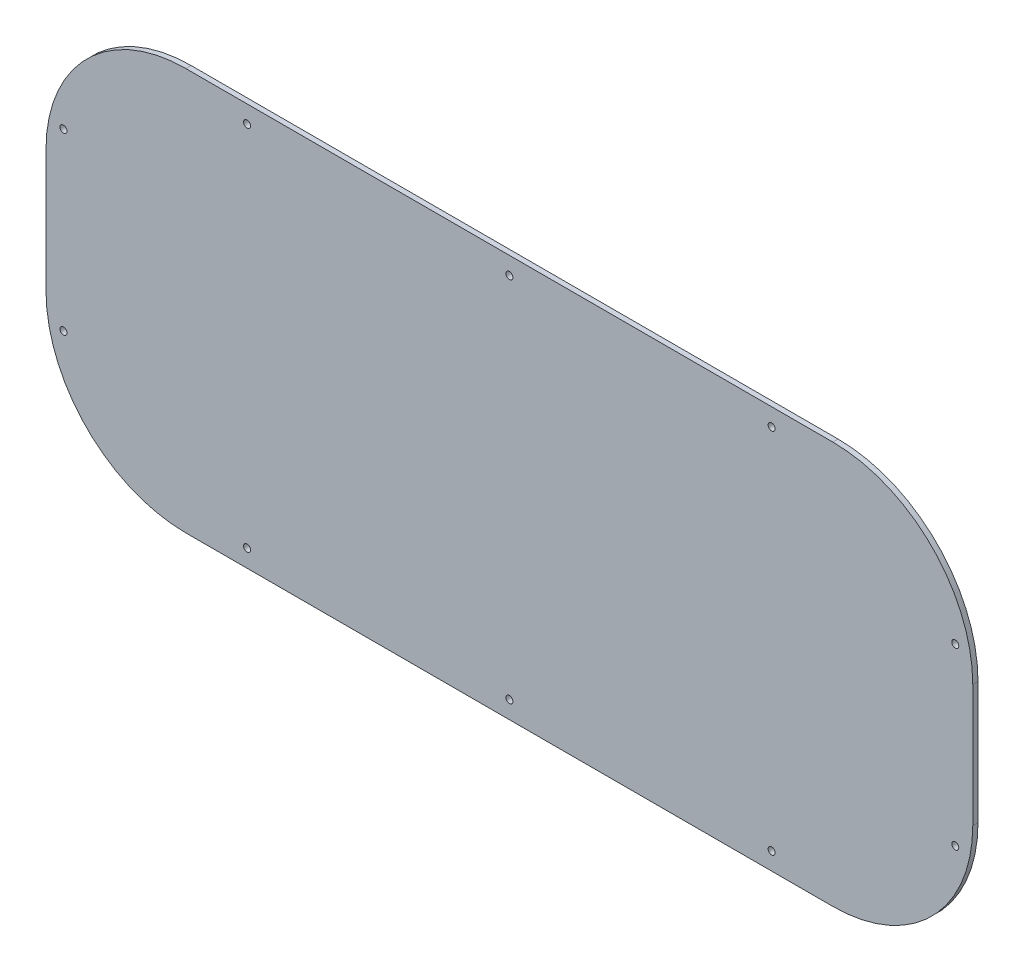
ISO-10303-21;
HEADER;
FILE_DESCRIPTION(('STEP AP214'),'2;1');
FILE_NAME('part.step','',(''),(''),'','','');
FILE_SCHEMA(('AUTOMOTIVE_DESIGN { 1 0 10303 214 1 1 1 1 }'));
ENDSEC;
DATA;
#1=APPLICATION_CONTEXT('core data for automotive mechanical design processes');
#2=APPLICATION_PROTOCOL_DEFINITION('international standard','automotive_design',2000,#1);
#3=PRODUCT_CONTEXT('',#1,'mechanical');
#4=PRODUCT('Part','Part','',(#3));
#5=PRODUCT_RELATED_PRODUCT_CATEGORY('part','',(#4));
#6=PRODUCT_DEFINITION_FORMATION('','',#4);
#7=PRODUCT_DEFINITION_CONTEXT('part definition',#1,'design');
#8=PRODUCT_DEFINITION('design','',#6,#7);
#9=PRODUCT_DEFINITION_SHAPE('','',#8);
#10=(LENGTH_UNIT() NAMED_UNIT(*) SI_UNIT(.MILLI.,.METRE.));
#11=(NAMED_UNIT(*) PLANE_ANGLE_UNIT() SI_UNIT($,.RADIAN.));
#12=(NAMED_UNIT(*) SI_UNIT($,.STERADIAN.) SOLID_ANGLE_UNIT());
#13=UNCERTAINTY_MEASURE_WITH_UNIT(LENGTH_MEASURE(1.E-05),#10,'distance_accuracy_value','');
#14=(GEOMETRIC_REPRESENTATION_CONTEXT(3) GLOBAL_UNCERTAINTY_ASSIGNED_CONTEXT((#13)) GLOBAL_UNIT_ASSIGNED_CONTEXT((#10,
#11,#12)) REPRESENTATION_CONTEXT('',''));
#15=CARTESIAN_POINT('',(0.,0.,0.));
#16=DIRECTION('',(0.,0.,1.));
#17=DIRECTION('',(1.,0.,0.));
#18=AXIS2_PLACEMENT_3D('',#15,#16,#17);
#19=CARTESIAN_POINT('',(265.,115.,3.));
#20=DIRECTION('',(-1.,0.,0.));
#21=DIRECTION('',(0.,0.,1.));
#22=AXIS2_PLACEMENT_3D('',#19,#20,#21);
#23=PLANE('',#22);
#24=DIRECTION('',(0.,1.,0.));
#25=VECTOR('',#24,1.);
#26=CARTESIAN_POINT('',(265.,115.,0.));
#27=LINE('',#26,#25);
#28=CARTESIAN_POINT('',(265.,-35.,0.));
#29=VERTEX_POINT('',#28);
#30=CARTESIAN_POINT('',(265.,35.,0.));
#31=VERTEX_POINT('',#30);
#32=EDGE_CURVE('E129',#29,#31,#27,.T.);
#33=ORIENTED_EDGE('',*,*,#32,.T.);
#34=DIRECTION('',(0.,0.,-1.));
#35=VECTOR('',#34,1.);
#36=CARTESIAN_POINT('',(265.,35.,3.));
#37=LINE('',#36,#35);
#38=CARTESIAN_POINT('',(265.,35.,3.));
#39=VERTEX_POINT('',#38);
#40=EDGE_CURVE('E107',#31,#39,#37,.F.);
#41=ORIENTED_EDGE('',*,*,#40,.T.);
#42=DIRECTION('',(0.,1.,0.));
#43=VECTOR('',#42,1.);
#44=CARTESIAN_POINT('',(265.,115.,3.));
#45=LINE('',#44,#43);
#46=CARTESIAN_POINT('',(265.,-35.,3.));
#47=VERTEX_POINT('',#46);
#48=EDGE_CURVE('E139',#47,#39,#45,.T.);
#49=ORIENTED_EDGE('',*,*,#48,.F.);
#50=DIRECTION('',(0.,0.,-1.));
#51=VECTOR('',#50,1.);
#52=CARTESIAN_POINT('',(265.,-35.,3.));
#53=LINE('',#52,#51);
#54=EDGE_CURVE('E112',#47,#29,#53,.T.);
#55=ORIENTED_EDGE('',*,*,#54,.T.);
#56=EDGE_LOOP('',(#33,#41,#49,#55));
#57=FACE_BOUND('',#56,.T.);
#58=ADVANCED_FACE('F34',(#57),#23,.F.);
#59=CARTESIAN_POINT('',(-265.,115.,3.));
#60=DIRECTION('',(0.,-1.,0.));
#61=DIRECTION('',(0.,0.,-1.));
#62=AXIS2_PLACEMENT_3D('',#59,#60,#61);
#63=PLANE('',#62);
#64=DIRECTION('',(-1.,0.,0.));
#65=VECTOR('',#64,1.);
#66=CARTESIAN_POINT('',(-265.,115.,3.));
#67=LINE('',#66,#65);
#68=CARTESIAN_POINT('',(185.,115.,3.));
#69=VERTEX_POINT('',#68);
#70=CARTESIAN_POINT('',(-185.,115.,3.));
#71=VERTEX_POINT('',#70);
#72=EDGE_CURVE('E122',#69,#71,#67,.T.);
#73=ORIENTED_EDGE('',*,*,#72,.F.);
#74=DIRECTION('',(0.,0.,-1.));
#75=VECTOR('',#74,1.);
#76=CARTESIAN_POINT('',(185.,115.,3.));
#77=LINE('',#76,#75);
#78=CARTESIAN_POINT('',(185.,115.,0.));
#79=VERTEX_POINT('',#78);
#80=EDGE_CURVE('E106',#69,#79,#77,.T.);
#81=ORIENTED_EDGE('',*,*,#80,.T.);
#82=DIRECTION('',(-1.,0.,0.));
#83=VECTOR('',#82,1.);
#84=CARTESIAN_POINT('',(-265.,115.,0.));
#85=LINE('',#84,#83);
#86=CARTESIAN_POINT('',(-185.,115.,0.));
#87=VERTEX_POINT('',#86);
#88=EDGE_CURVE('E119',#79,#87,#85,.T.);
#89=ORIENTED_EDGE('',*,*,#88,.T.);
#90=DIRECTION('',(0.,0.,-1.));
#91=VECTOR('',#90,1.);
#92=CARTESIAN_POINT('',(-185.,115.,3.));
#93=LINE('',#92,#91);
#94=EDGE_CURVE('E124',#87,#71,#93,.F.);
#95=ORIENTED_EDGE('',*,*,#94,.T.);
#96=EDGE_LOOP('',(#73,#81,#89,#95));
#97=FACE_BOUND('',#96,.T.);
#98=ADVANCED_FACE('F118',(#97),#63,.F.);
#99=CARTESIAN_POINT('',(-265.,115.,3.));
#100=DIRECTION('',(1.,0.,0.));
#101=DIRECTION('',(0.,0.,-1.));
#102=AXIS2_PLACEMENT_3D('',#99,#100,#101);
#103=PLANE('',#102);
#104=DIRECTION('',(0.,-1.,0.));
#105=VECTOR('',#104,1.);
#106=CARTESIAN_POINT('',(-265.,115.,3.));
#107=LINE('',#106,#105);
#108=CARTESIAN_POINT('',(-265.,35.,3.));
#109=VERTEX_POINT('',#108);
#110=CARTESIAN_POINT('',(-265.,-35.,3.));
#111=VERTEX_POINT('',#110);
#112=EDGE_CURVE('E204',#109,#111,#107,.T.);
#113=ORIENTED_EDGE('',*,*,#112,.F.);
#114=DIRECTION('',(0.,0.,-1.));
#115=VECTOR('',#114,1.);
#116=CARTESIAN_POINT('',(-265.,35.,3.));
#117=LINE('',#116,#115);
#118=CARTESIAN_POINT('',(-265.,35.,0.));
#119=VERTEX_POINT('',#118);
#120=EDGE_CURVE('E158',#109,#119,#117,.T.);
#121=ORIENTED_EDGE('',*,*,#120,.T.);
#122=DIRECTION('',(0.,-1.,0.));
#123=VECTOR('',#122,1.);
#124=CARTESIAN_POINT('',(-265.,115.,0.));
#125=LINE('',#124,#123);
#126=CARTESIAN_POINT('',(-265.,-35.,0.));
#127=VERTEX_POINT('',#126);
#128=EDGE_CURVE('E128',#119,#127,#125,.T.);
#129=ORIENTED_EDGE('',*,*,#128,.T.);
#130=DIRECTION('',(0.,0.,-1.));
#131=VECTOR('',#130,1.);
#132=CARTESIAN_POINT('',(-265.,-35.,3.));
#133=LINE('',#132,#131);
#134=EDGE_CURVE('E156',#127,#111,#133,.F.);
#135=ORIENTED_EDGE('',*,*,#134,.T.);
#136=EDGE_LOOP('',(#113,#121,#129,#135));
#137=FACE_BOUND('',#136,.T.);
#138=ADVANCED_FACE('F219',(#137),#103,.F.);
#139=CARTESIAN_POINT('',(-265.,-115.,3.));
#140=DIRECTION('',(0.,1.,0.));
#141=DIRECTION('',(0.,0.,1.));
#142=AXIS2_PLACEMENT_3D('',#139,#140,#141);
#143=PLANE('',#142);
#144=DIRECTION('',(1.,0.,0.));
#145=VECTOR('',#144,1.);
#146=CARTESIAN_POINT('',(-265.,-115.,3.));
#147=LINE('',#146,#145);
#148=CARTESIAN_POINT('',(-185.,-115.,3.));
#149=VERTEX_POINT('',#148);
#150=CARTESIAN_POINT('',(185.,-115.,3.));
#151=VERTEX_POINT('',#150);
#152=EDGE_CURVE('E140',#149,#151,#147,.T.);
#153=ORIENTED_EDGE('',*,*,#152,.F.);
#154=DIRECTION('',(0.,0.,-1.));
#155=VECTOR('',#154,1.);
#156=CARTESIAN_POINT('',(-185.,-115.,3.));
#157=LINE('',#156,#155);
#158=CARTESIAN_POINT('',(-185.,-115.,0.));
#159=VERTEX_POINT('',#158);
#160=EDGE_CURVE('E11',#149,#159,#157,.T.);
#161=ORIENTED_EDGE('',*,*,#160,.T.);
#162=DIRECTION('',(1.,0.,0.));
#163=VECTOR('',#162,1.);
#164=CARTESIAN_POINT('',(-265.,-115.,0.));
#165=LINE('',#164,#163);
#166=CARTESIAN_POINT('',(185.,-115.,0.));
#167=VERTEX_POINT('',#166);
#168=EDGE_CURVE('E132',#159,#167,#165,.T.);
#169=ORIENTED_EDGE('',*,*,#168,.T.);
#170=DIRECTION('',(0.,0.,-1.));
#171=VECTOR('',#170,1.);
#172=CARTESIAN_POINT('',(185.,-115.,3.));
#173=LINE('',#172,#171);
#174=EDGE_CURVE('E43',#167,#151,#173,.F.);
#175=ORIENTED_EDGE('',*,*,#174,.T.);
#176=EDGE_LOOP('',(#153,#161,#169,#175));
#177=FACE_BOUND('',#176,.T.);
#178=ADVANCED_FACE('F213',(#177),#143,.F.);
#179=CARTESIAN_POINT('',(0.,0.,3.));
#180=DIRECTION('',(0.,0.,1.));
#181=DIRECTION('',(1.,0.,0.));
#182=AXIS2_PLACEMENT_3D('',#179,#180,#181);
#183=PLANE('',#182);
#184=CARTESIAN_POINT('',(-150.,105.,3.));
#185=DIRECTION('',(0.,0.,1.));
#186=DIRECTION('',(1.,0.,0.));
#187=AXIS2_PLACEMENT_3D('',#184,#185,#186);
#188=CIRCLE('',#187,2.);
#189=CARTESIAN_POINT('',(-148.,105.,3.));
#190=VERTEX_POINT('',#189);
#191=EDGE_CURVE('E322',#190,#190,#188,.T.);
#192=ORIENTED_EDGE('',*,*,#191,.F.);
#193=EDGE_LOOP('',(#192));
#194=FACE_BOUND('',#193,.T.);
#195=CARTESIAN_POINT('',(-2.03851808720352E-13,105.,3.));
#196=DIRECTION('',(0.,0.,1.));
#197=DIRECTION('',(1.,0.,0.));
#198=AXIS2_PLACEMENT_3D('',#195,#196,#197);
#199=CIRCLE('',#198,2.);
#200=CARTESIAN_POINT('',(1.9999999999998,105.,3.));
#201=VERTEX_POINT('',#200);
#202=EDGE_CURVE('E319',#201,#201,#199,.T.);
#203=ORIENTED_EDGE('',*,*,#202,.F.);
#204=EDGE_LOOP('',(#203));
#205=FACE_BOUND('',#204,.T.);
#206=CARTESIAN_POINT('',(150.,105.,3.));
#207=DIRECTION('',(0.,0.,1.));
#208=DIRECTION('',(1.,0.,0.));
#209=AXIS2_PLACEMENT_3D('',#206,#207,#208);
#210=CIRCLE('',#209,2.);
#211=CARTESIAN_POINT('',(152.,105.,3.));
#212=VERTEX_POINT('',#211);
#213=EDGE_CURVE('E314',#212,#212,#210,.T.);
#214=ORIENTED_EDGE('',*,*,#213,.F.);
#215=EDGE_LOOP('',(#214));
#216=FACE_BOUND('',#215,.T.);
#217=CARTESIAN_POINT('',(255.,50.0000000000001,3.));
#218=DIRECTION('',(0.,0.,1.));
#219=DIRECTION('',(1.,0.,0.));
#220=AXIS2_PLACEMENT_3D('',#217,#218,#219);
#221=CIRCLE('',#220,2.);
#222=CARTESIAN_POINT('',(257.,50.0000000000001,3.));
#223=VERTEX_POINT('',#222);
#224=EDGE_CURVE('E309',#223,#223,#221,.T.);
#225=ORIENTED_EDGE('',*,*,#224,.F.);
#226=EDGE_LOOP('',(#225));
#227=FACE_BOUND('',#226,.T.);
#228=CARTESIAN_POINT('',(255.,-49.9999999999999,3.));
#229=DIRECTION('',(0.,0.,1.));
#230=DIRECTION('',(1.,0.,0.));
#231=AXIS2_PLACEMENT_3D('',#228,#229,#230);
#232=CIRCLE('',#231,2.);
#233=CARTESIAN_POINT('',(257.,-49.9999999999999,3.));
#234=VERTEX_POINT('',#233);
#235=EDGE_CURVE('E290',#234,#234,#232,.T.);
#236=ORIENTED_EDGE('',*,*,#235,.F.);
#237=EDGE_LOOP('',(#236));
#238=FACE_BOUND('',#237,.T.);
#239=CARTESIAN_POINT('',(150.,-105.,3.));
#240=DIRECTION('',(0.,0.,1.));
#241=DIRECTION('',(1.,0.,0.));
#242=AXIS2_PLACEMENT_3D('',#239,#240,#241);
#243=CIRCLE('',#242,2.);
#244=CARTESIAN_POINT('',(152.,-105.,3.));
#245=VERTEX_POINT('',#244);
#246=EDGE_CURVE('E199',#245,#245,#243,.T.);
#247=ORIENTED_EDGE('',*,*,#246,.F.);
#248=EDGE_LOOP('',(#247));
#249=FACE_BOUND('',#248,.T.);
#250=CARTESIAN_POINT('',(-3.20425226306045E-13,-105.,3.));
#251=DIRECTION('',(0.,0.,1.));
#252=DIRECTION('',(1.,0.,0.));
#253=AXIS2_PLACEMENT_3D('',#250,#251,#252);
#254=CIRCLE('',#253,2.);
#255=CARTESIAN_POINT('',(1.99999999999968,-105.,3.));
#256=VERTEX_POINT('',#255);
#257=EDGE_CURVE('E312',#256,#256,#254,.T.);
#258=ORIENTED_EDGE('',*,*,#257,.F.);
#259=EDGE_LOOP('',(#258));
#260=FACE_BOUND('',#259,.T.);
#261=CARTESIAN_POINT('',(-150.,-105.,3.));
#262=DIRECTION('',(0.,0.,1.));
#263=DIRECTION('',(1.,0.,0.));
#264=AXIS2_PLACEMENT_3D('',#261,#262,#263);
#265=CIRCLE('',#264,2.);
#266=CARTESIAN_POINT('',(-148.,-105.,3.));
#267=VERTEX_POINT('',#266);
#268=EDGE_CURVE('E327',#267,#267,#265,.T.);
#269=ORIENTED_EDGE('',*,*,#268,.F.);
#270=EDGE_LOOP('',(#269));
#271=FACE_BOUND('',#270,.T.);
#272=CARTESIAN_POINT('',(-255.,50.0000000000003,3.));
#273=DIRECTION('',(0.,0.,1.));
#274=DIRECTION('',(1.,0.,0.));
#275=AXIS2_PLACEMENT_3D('',#272,#273,#274);
#276=CIRCLE('',#275,2.);
#277=CARTESIAN_POINT('',(-253.,50.0000000000003,3.));
#278=VERTEX_POINT('',#277);
#279=EDGE_CURVE('E169',#278,#278,#276,.T.);
#280=ORIENTED_EDGE('',*,*,#279,.F.);
#281=EDGE_LOOP('',(#280));
#282=FACE_BOUND('',#281,.T.);
#283=CARTESIAN_POINT('',(-255.,-49.9999999999997,3.));
#284=DIRECTION('',(0.,0.,1.));
#285=DIRECTION('',(1.,0.,0.));
#286=AXIS2_PLACEMENT_3D('',#283,#284,#285);
#287=CIRCLE('',#286,2.);
#288=CARTESIAN_POINT('',(-253.,-49.9999999999997,3.));
#289=VERTEX_POINT('',#288);
#290=EDGE_CURVE('E164',#289,#289,#287,.T.);
#291=ORIENTED_EDGE('',*,*,#290,.F.);
#292=EDGE_LOOP('',(#291));
#293=FACE_BOUND('',#292,.T.);
#294=ORIENTED_EDGE('',*,*,#48,.T.);
#295=CARTESIAN_POINT('',(185.,35.,3.));
#296=DIRECTION('',(0.,0.,1.));
#297=DIRECTION('',(1.,0.,0.));
#298=AXIS2_PLACEMENT_3D('',#295,#296,#297);
#299=CIRCLE('',#298,80.);
#300=EDGE_CURVE('E154',#39,#69,#299,.T.);
#301=ORIENTED_EDGE('',*,*,#300,.T.);
#302=ORIENTED_EDGE('',*,*,#72,.T.);
#303=CARTESIAN_POINT('',(-185.,35.,3.));
#304=DIRECTION('',(0.,0.,1.));
#305=DIRECTION('',(1.,0.,0.));
#306=AXIS2_PLACEMENT_3D('',#303,#304,#305);
#307=CIRCLE('',#306,80.);
#308=EDGE_CURVE('E152',#71,#109,#307,.T.);
#309=ORIENTED_EDGE('',*,*,#308,.T.);
#310=ORIENTED_EDGE('',*,*,#112,.T.);
#311=CARTESIAN_POINT('',(-185.,-35.,3.));
#312=DIRECTION('',(0.,0.,1.));
#313=DIRECTION('',(1.,0.,0.));
#314=AXIS2_PLACEMENT_3D('',#311,#312,#313);
#315=CIRCLE('',#314,80.);
#316=EDGE_CURVE('E57',#111,#149,#315,.T.);
#317=ORIENTED_EDGE('',*,*,#316,.T.);
#318=ORIENTED_EDGE('',*,*,#152,.T.);
#319=CARTESIAN_POINT('',(185.,-35.,3.));
#320=DIRECTION('',(0.,0.,1.));
#321=DIRECTION('',(1.,0.,0.));
#322=AXIS2_PLACEMENT_3D('',#319,#320,#321);
#323=CIRCLE('',#322,80.);
#324=EDGE_CURVE('E149',#151,#47,#323,.T.);
#325=ORIENTED_EDGE('',*,*,#324,.T.);
#326=EDGE_LOOP('',(#294,#301,#302,#309,#310,#317,#318,#325));
#327=FACE_BOUND('',#326,.T.);
#328=ADVANCED_FACE('F206',(#194,#205,#216,#227,#238,#249,#260,#271,#282,#293,#327),#183,.T.);
#329=CARTESIAN_POINT('',(0.,0.,0.));
#330=DIRECTION('',(0.,0.,1.));
#331=DIRECTION('',(1.,0.,0.));
#332=AXIS2_PLACEMENT_3D('',#329,#330,#331);
#333=PLANE('',#332);
#334=CARTESIAN_POINT('',(-150.,105.,0.));
#335=DIRECTION('',(0.,0.,1.));
#336=DIRECTION('',(1.,0.,0.));
#337=AXIS2_PLACEMENT_3D('',#334,#335,#336);
#338=CIRCLE('',#337,2.);
#339=CARTESIAN_POINT('',(-148.,105.,0.));
#340=VERTEX_POINT('',#339);
#341=EDGE_CURVE('E38',#340,#340,#338,.T.);
#342=ORIENTED_EDGE('',*,*,#341,.T.);
#343=EDGE_LOOP('',(#342));
#344=FACE_BOUND('',#343,.T.);
#345=CARTESIAN_POINT('',(-2.03851808720352E-13,105.,0.));
#346=DIRECTION('',(0.,0.,1.));
#347=DIRECTION('',(1.,0.,0.));
#348=AXIS2_PLACEMENT_3D('',#345,#346,#347);
#349=CIRCLE('',#348,2.);
#350=CARTESIAN_POINT('',(1.9999999999998,105.,0.));
#351=VERTEX_POINT('',#350);
#352=EDGE_CURVE('E186',#351,#351,#349,.T.);
#353=ORIENTED_EDGE('',*,*,#352,.T.);
#354=EDGE_LOOP('',(#353));
#355=FACE_BOUND('',#354,.T.);
#356=CARTESIAN_POINT('',(150.,105.,0.));
#357=DIRECTION('',(0.,0.,1.));
#358=DIRECTION('',(1.,0.,0.));
#359=AXIS2_PLACEMENT_3D('',#356,#357,#358);
#360=CIRCLE('',#359,2.);
#361=CARTESIAN_POINT('',(152.,105.,0.));
#362=VERTEX_POINT('',#361);
#363=EDGE_CURVE('E184',#362,#362,#360,.T.);
#364=ORIENTED_EDGE('',*,*,#363,.T.);
#365=EDGE_LOOP('',(#364));
#366=FACE_BOUND('',#365,.T.);
#367=CARTESIAN_POINT('',(255.,50.0000000000001,0.));
#368=DIRECTION('',(0.,0.,1.));
#369=DIRECTION('',(1.,0.,0.));
#370=AXIS2_PLACEMENT_3D('',#367,#368,#369);
#371=CIRCLE('',#370,2.);
#372=CARTESIAN_POINT('',(257.,50.0000000000001,0.));
#373=VERTEX_POINT('',#372);
#374=EDGE_CURVE('E181',#373,#373,#371,.T.);
#375=ORIENTED_EDGE('',*,*,#374,.T.);
#376=EDGE_LOOP('',(#375));
#377=FACE_BOUND('',#376,.T.);
#378=CARTESIAN_POINT('',(255.,-49.9999999999999,0.));
#379=DIRECTION('',(0.,0.,1.));
#380=DIRECTION('',(1.,0.,0.));
#381=AXIS2_PLACEMENT_3D('',#378,#379,#380);
#382=CIRCLE('',#381,2.);
#383=CARTESIAN_POINT('',(257.,-49.9999999999999,0.));
#384=VERTEX_POINT('',#383);
#385=EDGE_CURVE('E178',#384,#384,#382,.T.);
#386=ORIENTED_EDGE('',*,*,#385,.T.);
#387=EDGE_LOOP('',(#386));
#388=FACE_BOUND('',#387,.T.);
#389=CARTESIAN_POINT('',(150.,-105.,0.));
#390=DIRECTION('',(0.,0.,1.));
#391=DIRECTION('',(1.,0.,0.));
#392=AXIS2_PLACEMENT_3D('',#389,#390,#391);
#393=CIRCLE('',#392,2.);
#394=CARTESIAN_POINT('',(152.,-105.,0.));
#395=VERTEX_POINT('',#394);
#396=EDGE_CURVE('E175',#395,#395,#393,.T.);
#397=ORIENTED_EDGE('',*,*,#396,.T.);
#398=EDGE_LOOP('',(#397));
#399=FACE_BOUND('',#398,.T.);
#400=CARTESIAN_POINT('',(-3.20425226306045E-13,-105.,0.));
#401=DIRECTION('',(0.,0.,1.));
#402=DIRECTION('',(1.,0.,0.));
#403=AXIS2_PLACEMENT_3D('',#400,#401,#402);
#404=CIRCLE('',#403,2.);
#405=CARTESIAN_POINT('',(1.99999999999968,-105.,0.));
#406=VERTEX_POINT('',#405);
#407=EDGE_CURVE('E172',#406,#406,#404,.T.);
#408=ORIENTED_EDGE('',*,*,#407,.T.);
#409=EDGE_LOOP('',(#408));
#410=FACE_BOUND('',#409,.T.);
#411=CARTESIAN_POINT('',(-150.,-105.,0.));
#412=DIRECTION('',(0.,0.,1.));
#413=DIRECTION('',(1.,0.,0.));
#414=AXIS2_PLACEMENT_3D('',#411,#412,#413);
#415=CIRCLE('',#414,2.);
#416=CARTESIAN_POINT('',(-148.,-105.,0.));
#417=VERTEX_POINT('',#416);
#418=EDGE_CURVE('E168',#417,#417,#415,.T.);
#419=ORIENTED_EDGE('',*,*,#418,.T.);
#420=EDGE_LOOP('',(#419));
#421=FACE_BOUND('',#420,.T.);
#422=CARTESIAN_POINT('',(-255.,50.0000000000003,0.));
#423=DIRECTION('',(0.,0.,1.));
#424=DIRECTION('',(1.,0.,0.));
#425=AXIS2_PLACEMENT_3D('',#422,#423,#424);
#426=CIRCLE('',#425,2.);
#427=CARTESIAN_POINT('',(-253.,50.0000000000003,0.));
#428=VERTEX_POINT('',#427);
#429=EDGE_CURVE('E165',#428,#428,#426,.T.);
#430=ORIENTED_EDGE('',*,*,#429,.T.);
#431=EDGE_LOOP('',(#430));
#432=FACE_BOUND('',#431,.T.);
#433=CARTESIAN_POINT('',(-255.,-49.9999999999997,0.));
#434=DIRECTION('',(0.,0.,1.));
#435=DIRECTION('',(1.,0.,0.));
#436=AXIS2_PLACEMENT_3D('',#433,#434,#435);
#437=CIRCLE('',#436,2.);
#438=CARTESIAN_POINT('',(-253.,-49.9999999999997,0.));
#439=VERTEX_POINT('',#438);
#440=EDGE_CURVE('E134',#439,#439,#437,.T.);
#441=ORIENTED_EDGE('',*,*,#440,.T.);
#442=EDGE_LOOP('',(#441));
#443=FACE_BOUND('',#442,.T.);
#444=ORIENTED_EDGE('',*,*,#88,.F.);
#445=CARTESIAN_POINT('',(185.,35.,0.));
#446=DIRECTION('',(0.,0.,1.));
#447=DIRECTION('',(1.,0.,0.));
#448=AXIS2_PLACEMENT_3D('',#445,#446,#447);
#449=CIRCLE('',#448,80.);
#450=EDGE_CURVE('E102',#79,#31,#449,.F.);
#451=ORIENTED_EDGE('',*,*,#450,.T.);
#452=ORIENTED_EDGE('',*,*,#32,.F.);
#453=CARTESIAN_POINT('',(185.,-35.,0.));
#454=DIRECTION('',(0.,0.,1.));
#455=DIRECTION('',(1.,0.,0.));
#456=AXIS2_PLACEMENT_3D('',#453,#454,#455);
#457=CIRCLE('',#456,80.);
#458=EDGE_CURVE('E123',#29,#167,#457,.F.);
#459=ORIENTED_EDGE('',*,*,#458,.T.);
#460=ORIENTED_EDGE('',*,*,#168,.F.);
#461=CARTESIAN_POINT('',(-185.,-35.,0.));
#462=DIRECTION('',(0.,0.,1.));
#463=DIRECTION('',(1.,0.,0.));
#464=AXIS2_PLACEMENT_3D('',#461,#462,#463);
#465=CIRCLE('',#464,80.);
#466=EDGE_CURVE('E143',#159,#127,#465,.F.);
#467=ORIENTED_EDGE('',*,*,#466,.T.);
#468=ORIENTED_EDGE('',*,*,#128,.F.);
#469=CARTESIAN_POINT('',(-185.,35.,0.));
#470=DIRECTION('',(0.,0.,1.));
#471=DIRECTION('',(1.,0.,0.));
#472=AXIS2_PLACEMENT_3D('',#469,#470,#471);
#473=CIRCLE('',#472,80.);
#474=EDGE_CURVE('E113',#119,#87,#473,.F.);
#475=ORIENTED_EDGE('',*,*,#474,.T.);
#476=EDGE_LOOP('',(#444,#451,#452,#459,#460,#467,#468,#475));
#477=FACE_BOUND('',#476,.T.);
#478=ADVANCED_FACE('F126',(#344,#355,#366,#377,#388,#399,#410,#421,#432,#443,#477),#333,.F.);
#479=CARTESIAN_POINT('',(185.,35.,3.));
#480=DIRECTION('',(0.,0.,-1.));
#481=DIRECTION('',(-1.,0.,0.));
#482=AXIS2_PLACEMENT_3D('',#479,#480,#481);
#483=CYLINDRICAL_SURFACE('',#482,80.);
#484=ORIENTED_EDGE('',*,*,#300,.F.);
#485=ORIENTED_EDGE('',*,*,#40,.F.);
#486=ORIENTED_EDGE('',*,*,#450,.F.);
#487=ORIENTED_EDGE('',*,*,#80,.F.);
#488=EDGE_LOOP('',(#484,#485,#486,#487));
#489=FACE_BOUND('',#488,.T.);
#490=ADVANCED_FACE('F105',(#489),#483,.T.);
#491=CARTESIAN_POINT('',(-185.,35.,3.));
#492=DIRECTION('',(0.,0.,-1.));
#493=DIRECTION('',(-1.,0.,0.));
#494=AXIS2_PLACEMENT_3D('',#491,#492,#493);
#495=CYLINDRICAL_SURFACE('',#494,80.);
#496=ORIENTED_EDGE('',*,*,#308,.F.);
#497=ORIENTED_EDGE('',*,*,#94,.F.);
#498=ORIENTED_EDGE('',*,*,#474,.F.);
#499=ORIENTED_EDGE('',*,*,#120,.F.);
#500=EDGE_LOOP('',(#496,#497,#498,#499));
#501=FACE_BOUND('',#500,.T.);
#502=ADVANCED_FACE('F223',(#501),#495,.T.);
#503=CARTESIAN_POINT('',(-185.,-35.,3.));
#504=DIRECTION('',(0.,0.,-1.));
#505=DIRECTION('',(-1.,0.,0.));
#506=AXIS2_PLACEMENT_3D('',#503,#504,#505);
#507=CYLINDRICAL_SURFACE('',#506,80.);
#508=ORIENTED_EDGE('',*,*,#316,.F.);
#509=ORIENTED_EDGE('',*,*,#134,.F.);
#510=ORIENTED_EDGE('',*,*,#466,.F.);
#511=ORIENTED_EDGE('',*,*,#160,.F.);
#512=EDGE_LOOP('',(#508,#509,#510,#511));
#513=FACE_BOUND('',#512,.T.);
#514=ADVANCED_FACE('F215',(#513),#507,.T.);
#515=CARTESIAN_POINT('',(185.,-35.,3.));
#516=DIRECTION('',(0.,0.,-1.));
#517=DIRECTION('',(-1.,0.,0.));
#518=AXIS2_PLACEMENT_3D('',#515,#516,#517);
#519=CYLINDRICAL_SURFACE('',#518,80.);
#520=ORIENTED_EDGE('',*,*,#324,.F.);
#521=ORIENTED_EDGE('',*,*,#174,.F.);
#522=ORIENTED_EDGE('',*,*,#458,.F.);
#523=ORIENTED_EDGE('',*,*,#54,.F.);
#524=EDGE_LOOP('',(#520,#521,#522,#523));
#525=FACE_BOUND('',#524,.T.);
#526=ADVANCED_FACE('F36',(#525),#519,.T.);
#527=CARTESIAN_POINT('',(-255.,-49.9999999999997,-7.));
#528=DIRECTION('',(0.,0.,1.));
#529=DIRECTION('',(1.,0.,0.));
#530=AXIS2_PLACEMENT_3D('',#527,#528,#529);
#531=CYLINDRICAL_SURFACE('',#530,2.);
#532=ORIENTED_EDGE('',*,*,#290,.T.);
#533=EDGE_LOOP('',(#532));
#534=FACE_BOUND('',#533,.T.);
#535=ORIENTED_EDGE('',*,*,#440,.F.);
#536=EDGE_LOOP('',(#535));
#537=FACE_BOUND('',#536,.T.);
#538=ADVANCED_FACE('F247',(#534,#537),#531,.F.);
#539=CARTESIAN_POINT('',(-255.,50.0000000000003,-7.));
#540=DIRECTION('',(0.,0.,1.));
#541=DIRECTION('',(1.,0.,0.));
#542=AXIS2_PLACEMENT_3D('',#539,#540,#541);
#543=CYLINDRICAL_SURFACE('',#542,2.);
#544=ORIENTED_EDGE('',*,*,#279,.T.);
#545=EDGE_LOOP('',(#544));
#546=FACE_BOUND('',#545,.T.);
#547=ORIENTED_EDGE('',*,*,#429,.F.);
#548=EDGE_LOOP('',(#547));
#549=FACE_BOUND('',#548,.T.);
#550=ADVANCED_FACE('F250',(#546,#549),#543,.F.);
#551=CARTESIAN_POINT('',(-150.,-105.,-7.));
#552=DIRECTION('',(0.,0.,1.));
#553=DIRECTION('',(1.,0.,0.));
#554=AXIS2_PLACEMENT_3D('',#551,#552,#553);
#555=CYLINDRICAL_SURFACE('',#554,2.);
#556=ORIENTED_EDGE('',*,*,#268,.T.);
#557=EDGE_LOOP('',(#556));
#558=FACE_BOUND('',#557,.T.);
#559=ORIENTED_EDGE('',*,*,#418,.F.);
#560=EDGE_LOOP('',(#559));
#561=FACE_BOUND('',#560,.T.);
#562=ADVANCED_FACE('F259',(#558,#561),#555,.F.);
#563=CARTESIAN_POINT('',(-3.20425226306045E-13,-105.,-7.));
#564=DIRECTION('',(0.,0.,1.));
#565=DIRECTION('',(1.,0.,0.));
#566=AXIS2_PLACEMENT_3D('',#563,#564,#565);
#567=CYLINDRICAL_SURFACE('',#566,2.);
#568=ORIENTED_EDGE('',*,*,#257,.T.);
#569=EDGE_LOOP('',(#568));
#570=FACE_BOUND('',#569,.T.);
#571=ORIENTED_EDGE('',*,*,#407,.F.);
#572=EDGE_LOOP('',(#571));
#573=FACE_BOUND('',#572,.T.);
#574=ADVANCED_FACE('F255',(#570,#573),#567,.F.);
#575=CARTESIAN_POINT('',(150.,-105.,-7.));
#576=DIRECTION('',(0.,0.,1.));
#577=DIRECTION('',(1.,0.,0.));
#578=AXIS2_PLACEMENT_3D('',#575,#576,#577);
#579=CYLINDRICAL_SURFACE('',#578,2.);
#580=ORIENTED_EDGE('',*,*,#246,.T.);
#581=EDGE_LOOP('',(#580));
#582=FACE_BOUND('',#581,.T.);
#583=ORIENTED_EDGE('',*,*,#396,.F.);
#584=EDGE_LOOP('',(#583));
#585=FACE_BOUND('',#584,.T.);
#586=ADVANCED_FACE('F251',(#582,#585),#579,.F.);
#587=CARTESIAN_POINT('',(255.,-49.9999999999999,-7.));
#588=DIRECTION('',(0.,0.,1.));
#589=DIRECTION('',(1.,0.,0.));
#590=AXIS2_PLACEMENT_3D('',#587,#588,#589);
#591=CYLINDRICAL_SURFACE('',#590,2.);
#592=ORIENTED_EDGE('',*,*,#235,.T.);
#593=EDGE_LOOP('',(#592));
#594=FACE_BOUND('',#593,.T.);
#595=ORIENTED_EDGE('',*,*,#385,.F.);
#596=EDGE_LOOP('',(#595));
#597=FACE_BOUND('',#596,.T.);
#598=ADVANCED_FACE('F254',(#594,#597),#591,.F.);
#599=CARTESIAN_POINT('',(255.,50.0000000000001,-7.));
#600=DIRECTION('',(0.,0.,1.));
#601=DIRECTION('',(1.,0.,0.));
#602=AXIS2_PLACEMENT_3D('',#599,#600,#601);
#603=CYLINDRICAL_SURFACE('',#602,2.);
#604=ORIENTED_EDGE('',*,*,#224,.T.);
#605=EDGE_LOOP('',(#604));
#606=FACE_BOUND('',#605,.T.);
#607=ORIENTED_EDGE('',*,*,#374,.F.);
#608=EDGE_LOOP('',(#607));
#609=FACE_BOUND('',#608,.T.);
#610=ADVANCED_FACE('F278',(#606,#609),#603,.F.);
#611=CARTESIAN_POINT('',(150.,105.,-7.));
#612=DIRECTION('',(0.,0.,1.));
#613=DIRECTION('',(1.,0.,0.));
#614=AXIS2_PLACEMENT_3D('',#611,#612,#613);
#615=CYLINDRICAL_SURFACE('',#614,2.);
#616=ORIENTED_EDGE('',*,*,#213,.T.);
#617=EDGE_LOOP('',(#616));
#618=FACE_BOUND('',#617,.T.);
#619=ORIENTED_EDGE('',*,*,#363,.F.);
#620=EDGE_LOOP('',(#619));
#621=FACE_BOUND('',#620,.T.);
#622=ADVANCED_FACE('F274',(#618,#621),#615,.F.);
#623=CARTESIAN_POINT('',(-2.03851808720352E-13,105.,-7.));
#624=DIRECTION('',(0.,0.,1.));
#625=DIRECTION('',(1.,0.,0.));
#626=AXIS2_PLACEMENT_3D('',#623,#624,#625);
#627=CYLINDRICAL_SURFACE('',#626,2.);
#628=ORIENTED_EDGE('',*,*,#202,.T.);
#629=EDGE_LOOP('',(#628));
#630=FACE_BOUND('',#629,.T.);
#631=ORIENTED_EDGE('',*,*,#352,.F.);
#632=EDGE_LOOP('',(#631));
#633=FACE_BOUND('',#632,.T.);
#634=ADVANCED_FACE('F270',(#630,#633),#627,.F.);
#635=CARTESIAN_POINT('',(-150.,105.,-7.));
#636=DIRECTION('',(0.,0.,1.));
#637=DIRECTION('',(1.,0.,0.));
#638=AXIS2_PLACEMENT_3D('',#635,#636,#637);
#639=CYLINDRICAL_SURFACE('',#638,2.);
#640=ORIENTED_EDGE('',*,*,#191,.T.);
#641=EDGE_LOOP('',(#640));
#642=FACE_BOUND('',#641,.T.);
#643=ORIENTED_EDGE('',*,*,#341,.F.);
#644=EDGE_LOOP('',(#643));
#645=FACE_BOUND('',#644,.T.);
#646=ADVANCED_FACE('F267',(#642,#645),#639,.F.);
#647=CLOSED_SHELL('',(#58,#98,#138,#178,#328,#478,#490,#502,#514,#526,#538,#550,#562,#574,#586,
#598,#610,#622,#634,#646));
#648=MANIFOLD_SOLID_BREP('B2',#647);
#649=ADVANCED_BREP_SHAPE_REPRESENTATION('',(#18,#648),#14);
#650=SHAPE_DEFINITION_REPRESENTATION(#9,#649);
ENDSEC;
END-ISO-10303-21;
